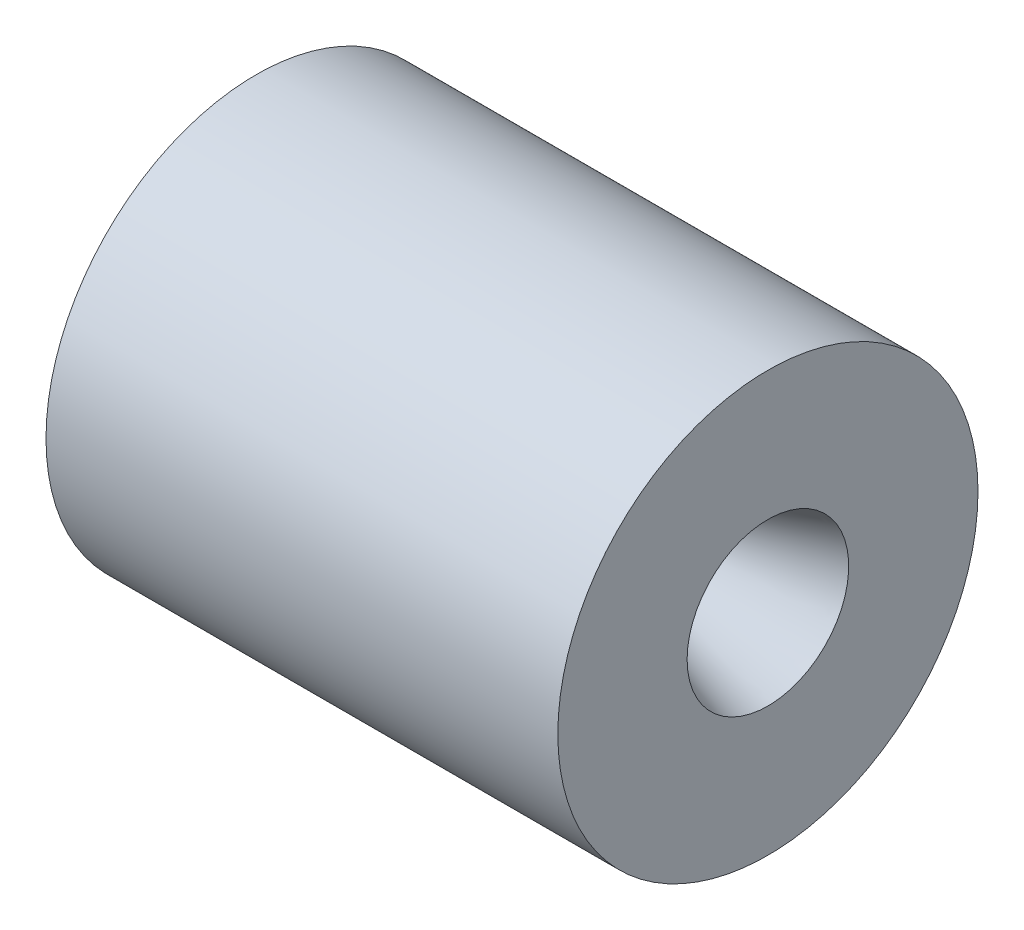
ISO-10303-21;
HEADER;
FILE_DESCRIPTION(('STEP AP214'),'2;1');
FILE_NAME('part.step','',(''),(''),'','','');
FILE_SCHEMA(('AUTOMOTIVE_DESIGN { 1 0 10303 214 1 1 1 1 }'));
ENDSEC;
DATA;
#1=APPLICATION_CONTEXT('core data for automotive mechanical design processes');
#2=APPLICATION_PROTOCOL_DEFINITION('international standard','automotive_design',2000,#1);
#3=PRODUCT_CONTEXT('',#1,'mechanical');
#4=PRODUCT('Part','Part','',(#3));
#5=PRODUCT_RELATED_PRODUCT_CATEGORY('part','',(#4));
#6=PRODUCT_DEFINITION_FORMATION('','',#4);
#7=PRODUCT_DEFINITION_CONTEXT('part definition',#1,'design');
#8=PRODUCT_DEFINITION('design','',#6,#7);
#9=PRODUCT_DEFINITION_SHAPE('','',#8);
#10=(LENGTH_UNIT() NAMED_UNIT(*) SI_UNIT(.MILLI.,.METRE.));
#11=(NAMED_UNIT(*) PLANE_ANGLE_UNIT() SI_UNIT($,.RADIAN.));
#12=(NAMED_UNIT(*) SI_UNIT($,.STERADIAN.) SOLID_ANGLE_UNIT());
#13=UNCERTAINTY_MEASURE_WITH_UNIT(LENGTH_MEASURE(1.E-05),#10,'distance_accuracy_value','');
#14=(GEOMETRIC_REPRESENTATION_CONTEXT(3) GLOBAL_UNCERTAINTY_ASSIGNED_CONTEXT((#13)) GLOBAL_UNIT_ASSIGNED_CONTEXT((#10,
#11,#12)) REPRESENTATION_CONTEXT('',''));
#15=CARTESIAN_POINT('',(0.,0.,0.));
#16=DIRECTION('',(0.,0.,1.));
#17=DIRECTION('',(1.,0.,0.));
#18=AXIS2_PLACEMENT_3D('',#15,#16,#17);
#19=CARTESIAN_POINT('',(0.,55.140272,0.));
#20=DIRECTION('',(1.,0.,0.));
#21=DIRECTION('',(0.,0.,-1.));
#22=AXIS2_PLACEMENT_3D('',#19,#20,#21);
#23=PLANE('',#22);
#24=CARTESIAN_POINT('',(0.,0.,-69.));
#25=DIRECTION('',(-1.,0.,0.));
#26=DIRECTION('',(0.,0.,1.));
#27=AXIS2_PLACEMENT_3D('',#24,#25,#26);
#28=CIRCLE('',#27,2.57975099999999);
#29=CARTESIAN_POINT('',(0.,0.,-66.420249));
#30=VERTEX_POINT('',#29);
#31=EDGE_CURVE('E118',#30,#30,#28,.T.);
#32=ORIENTED_EDGE('',*,*,#31,.F.);
#33=EDGE_LOOP('',(#32));
#34=FACE_BOUND('',#33,.T.);
#35=CARTESIAN_POINT('',(0.,-69.,-2.40912212380176E-13));
#36=DIRECTION('',(-1.,0.,0.));
#37=DIRECTION('',(0.,0.,1.));
#38=AXIS2_PLACEMENT_3D('',#35,#36,#37);
#39=CIRCLE('',#38,2.57975099999999);
#40=CARTESIAN_POINT('',(0.,-69.,2.57975099999975));
#41=VERTEX_POINT('',#40);
#42=EDGE_CURVE('E136',#41,#41,#39,.T.);
#43=ORIENTED_EDGE('',*,*,#42,.F.);
#44=EDGE_LOOP('',(#43));
#45=FACE_BOUND('',#44,.T.);
#46=CARTESIAN_POINT('',(0.,-59.7557528611264,34.4999999999999));
#47=DIRECTION('',(-1.,0.,0.));
#48=DIRECTION('',(0.,0.,1.));
#49=AXIS2_PLACEMENT_3D('',#46,#47,#48);
#50=CIRCLE('',#49,2.57975099999999);
#51=CARTESIAN_POINT('',(0.,-59.7557528611264,37.0797509999999));
#52=VERTEX_POINT('',#51);
#53=EDGE_CURVE('E142',#52,#52,#50,.T.);
#54=ORIENTED_EDGE('',*,*,#53,.F.);
#55=EDGE_LOOP('',(#54));
#56=FACE_BOUND('',#55,.T.);
#57=CARTESIAN_POINT('',(0.,-34.5000000000001,59.7557528611262));
#58=DIRECTION('',(-1.,0.,0.));
#59=DIRECTION('',(0.,0.,1.));
#60=AXIS2_PLACEMENT_3D('',#57,#58,#59);
#61=CIRCLE('',#60,2.57975099999999);
#62=CARTESIAN_POINT('',(0.,-34.5000000000001,62.3355038611262));
#63=VERTEX_POINT('',#62);
#64=EDGE_CURVE('E148',#63,#63,#61,.T.);
#65=ORIENTED_EDGE('',*,*,#64,.F.);
#66=EDGE_LOOP('',(#65));
#67=FACE_BOUND('',#66,.T.);
#68=CARTESIAN_POINT('',(0.,0.,69.));
#69=DIRECTION('',(-1.,0.,0.));
#70=DIRECTION('',(0.,0.,1.));
#71=AXIS2_PLACEMENT_3D('',#68,#69,#70);
#72=CIRCLE('',#71,2.57975099999999);
#73=CARTESIAN_POINT('',(0.,0.,71.579751));
#74=VERTEX_POINT('',#73);
#75=EDGE_CURVE('E154',#74,#74,#72,.T.);
#76=ORIENTED_EDGE('',*,*,#75,.F.);
#77=EDGE_LOOP('',(#76));
#78=FACE_BOUND('',#77,.T.);
#79=CARTESIAN_POINT('',(0.,0.,0.));
#80=DIRECTION('',(-1.,0.,0.));
#81=DIRECTION('',(0.,0.,1.));
#82=AXIS2_PLACEMENT_3D('',#79,#80,#81);
#83=CIRCLE('',#82,55.140272);
#84=CARTESIAN_POINT('',(0.,0.,55.140272));
#85=VERTEX_POINT('',#84);
#86=EDGE_CURVE('E181',#85,#85,#83,.T.);
#87=ORIENTED_EDGE('',*,*,#86,.F.);
#88=EDGE_LOOP('',(#87));
#89=FACE_BOUND('',#88,.T.);
#90=CARTESIAN_POINT('',(0.,0.,0.));
#91=DIRECTION('',(-1.,0.,0.));
#92=DIRECTION('',(0.,0.,1.));
#93=AXIS2_PLACEMENT_3D('',#90,#91,#92);
#94=CIRCLE('',#93,76.200272);
#95=CARTESIAN_POINT('',(0.,0.,76.200272));
#96=VERTEX_POINT('',#95);
#97=EDGE_CURVE('E184',#96,#96,#94,.T.);
#98=ORIENTED_EDGE('',*,*,#97,.T.);
#99=EDGE_LOOP('',(#98));
#100=FACE_BOUND('',#99,.T.);
#101=CARTESIAN_POINT('',(0.,-59.7557528611261,-34.5000000000003));
#102=DIRECTION('',(-1.,0.,0.));
#103=DIRECTION('',(0.,0.,1.));
#104=AXIS2_PLACEMENT_3D('',#101,#102,#103);
#105=CIRCLE('',#104,2.57975099999999);
#106=CARTESIAN_POINT('',(0.,-59.7557528611261,-31.9202490000003));
#107=VERTEX_POINT('',#106);
#108=EDGE_CURVE('E130',#107,#107,#105,.T.);
#109=ORIENTED_EDGE('',*,*,#108,.F.);
#110=EDGE_LOOP('',(#109));
#111=FACE_BOUND('',#110,.T.);
#112=CARTESIAN_POINT('',(0.,-34.4999999999997,-59.7557528611265));
#113=DIRECTION('',(-1.,0.,0.));
#114=DIRECTION('',(0.,0.,1.));
#115=AXIS2_PLACEMENT_3D('',#112,#113,#114);
#116=CIRCLE('',#115,2.57975099999999);
#117=CARTESIAN_POINT('',(0.,-34.4999999999997,-57.1760018611265));
#118=VERTEX_POINT('',#117);
#119=EDGE_CURVE('E124',#118,#118,#116,.T.);
#120=ORIENTED_EDGE('',*,*,#119,.F.);
#121=EDGE_LOOP('',(#120));
#122=FACE_BOUND('',#121,.T.);
#123=CARTESIAN_POINT('',(0.,34.5000000000005,-59.755752861126));
#124=DIRECTION('',(-1.,0.,0.));
#125=DIRECTION('',(0.,0.,1.));
#126=AXIS2_PLACEMENT_3D('',#123,#124,#125);
#127=CIRCLE('',#126,2.57975099999999);
#128=CARTESIAN_POINT('',(0.,34.5000000000005,-57.176001861126));
#129=VERTEX_POINT('',#128);
#130=EDGE_CURVE('E112',#129,#129,#127,.T.);
#131=ORIENTED_EDGE('',*,*,#130,.F.);
#132=EDGE_LOOP('',(#131));
#133=FACE_BOUND('',#132,.T.);
#134=CARTESIAN_POINT('',(0.,59.7557528611266,-34.4999999999994));
#135=DIRECTION('',(-1.,0.,0.));
#136=DIRECTION('',(0.,0.,1.));
#137=AXIS2_PLACEMENT_3D('',#134,#135,#136);
#138=CIRCLE('',#137,2.57975099999999);
#139=CARTESIAN_POINT('',(0.,59.7557528611266,-31.9202489999995));
#140=VERTEX_POINT('',#139);
#141=EDGE_CURVE('E106',#140,#140,#138,.T.);
#142=ORIENTED_EDGE('',*,*,#141,.F.);
#143=EDGE_LOOP('',(#142));
#144=FACE_BOUND('',#143,.T.);
#145=CARTESIAN_POINT('',(0.,69.,7.22736637140529E-13));
#146=DIRECTION('',(-1.,0.,0.));
#147=DIRECTION('',(0.,0.,1.));
#148=AXIS2_PLACEMENT_3D('',#145,#146,#147);
#149=CIRCLE('',#148,2.57975099999999);
#150=CARTESIAN_POINT('',(0.,69.,2.57975100000071));
#151=VERTEX_POINT('',#150);
#152=EDGE_CURVE('E100',#151,#151,#149,.T.);
#153=ORIENTED_EDGE('',*,*,#152,.F.);
#154=EDGE_LOOP('',(#153));
#155=FACE_BOUND('',#154,.T.);
#156=CARTESIAN_POINT('',(0.,59.7557528611259,34.5000000000007));
#157=DIRECTION('',(-1.,0.,0.));
#158=DIRECTION('',(0.,0.,1.));
#159=AXIS2_PLACEMENT_3D('',#156,#157,#158);
#160=CIRCLE('',#159,2.57975099999999);
#161=CARTESIAN_POINT('',(0.,59.7557528611259,37.0797510000007));
#162=VERTEX_POINT('',#161);
#163=EDGE_CURVE('E89',#162,#162,#160,.T.);
#164=ORIENTED_EDGE('',*,*,#163,.F.);
#165=EDGE_LOOP('',(#164));
#166=FACE_BOUND('',#165,.T.);
#167=CARTESIAN_POINT('',(0.,34.4999999999992,59.7557528611267));
#168=DIRECTION('',(-1.,0.,0.));
#169=DIRECTION('',(0.,0.,1.));
#170=AXIS2_PLACEMENT_3D('',#167,#168,#169);
#171=CIRCLE('',#170,2.57975099999999);
#172=CARTESIAN_POINT('',(0.,34.4999999999992,62.3355038611267));
#173=VERTEX_POINT('',#172);
#174=EDGE_CURVE('E90',#173,#173,#171,.T.);
#175=ORIENTED_EDGE('',*,*,#174,.F.);
#176=EDGE_LOOP('',(#175));
#177=FACE_BOUND('',#176,.T.);
#178=ADVANCED_FACE('F33',(#34,#45,#56,#67,#78,#89,#100,#111,#122,#133,#144,#155,#166,#177),#23,.F.);
#179=CARTESIAN_POINT('',(140.608875713067,14.0680911814763,0.));
#180=CARTESIAN_POINT('',(181.460140895811,28.0308978195395,0.));
#181=CARTESIAN_POINT('',(185.649173895811,29.3102708195395,0.));
#182=B_SPLINE_CURVE_WITH_KNOTS('',2,(#179,#180,#181),.UNSPECIFIED.,.F.,.F.,(3,3),(0.,1.),.UNSPECIFIED.);
#183=CARTESIAN_POINT('',(0.,0.,0.));
#184=DIRECTION('',(-1.,0.,0.));
#185=AXIS1_PLACEMENT('',#183,#184);
#186=SURFACE_OF_REVOLUTION('',#182,#185);
#187=CARTESIAN_POINT('',(185.649173895811,0.,0.));
#188=DIRECTION('',(-1.,0.,0.));
#189=DIRECTION('',(0.,0.,1.));
#190=AXIS2_PLACEMENT_3D('',#187,#188,#189);
#191=CIRCLE('',#190,29.3102708195395);
#192=CARTESIAN_POINT('',(185.649173895811,0.,29.3102708195395));
#193=VERTEX_POINT('',#192);
#194=EDGE_CURVE('E11',#193,#193,#191,.T.);
#195=ORIENTED_EDGE('',*,*,#194,.F.);
#196=EDGE_LOOP('',(#195));
#197=FACE_BOUND('',#196,.T.);
#198=CARTESIAN_POINT('',(140.608875713067,0.,0.));
#199=DIRECTION('',(-1.,0.,0.));
#200=DIRECTION('',(0.,0.,1.));
#201=AXIS2_PLACEMENT_3D('',#198,#199,#200);
#202=CIRCLE('',#201,14.0680911814763);
#203=CARTESIAN_POINT('',(140.608875713067,0.,14.0680911814763));
#204=VERTEX_POINT('',#203);
#205=EDGE_CURVE('E159',#204,#204,#202,.T.);
#206=ORIENTED_EDGE('',*,*,#205,.T.);
#207=EDGE_LOOP('',(#206));
#208=FACE_BOUND('',#207,.T.);
#209=ADVANCED_FACE('F35',(#197,#208),#186,.T.);
#210=CARTESIAN_POINT('',(185.649173895811,76.200272,0.));
#211=DIRECTION('',(-1.,0.,0.));
#212=DIRECTION('',(0.,0.,1.));
#213=AXIS2_PLACEMENT_3D('',#210,#211,#212);
#214=PLANE('',#213);
#215=CARTESIAN_POINT('',(185.649173895811,0.,0.));
#216=DIRECTION('',(-1.,0.,0.));
#217=DIRECTION('',(0.,0.,1.));
#218=AXIS2_PLACEMENT_3D('',#215,#216,#217);
#219=CIRCLE('',#218,76.200272);
#220=CARTESIAN_POINT('',(185.649173895811,0.,76.200272));
#221=VERTEX_POINT('',#220);
#222=EDGE_CURVE('E42',#221,#221,#219,.T.);
#223=ORIENTED_EDGE('',*,*,#222,.F.);
#224=EDGE_LOOP('',(#223));
#225=FACE_BOUND('',#224,.T.);
#226=ORIENTED_EDGE('',*,*,#194,.T.);
#227=EDGE_LOOP('',(#226));
#228=FACE_BOUND('',#227,.T.);
#229=ADVANCED_FACE('F191',(#225,#228),#214,.F.);
#230=CARTESIAN_POINT('',(0.,0.,0.));
#231=DIRECTION('',(-1.,0.,0.));
#232=DIRECTION('',(0.,0.,1.));
#233=AXIS2_PLACEMENT_3D('',#230,#231,#232);
#234=CYLINDRICAL_SURFACE('',#233,76.200272);
#235=ORIENTED_EDGE('',*,*,#97,.F.);
#236=EDGE_LOOP('',(#235));
#237=FACE_BOUND('',#236,.T.);
#238=ORIENTED_EDGE('',*,*,#222,.T.);
#239=EDGE_LOOP('',(#238));
#240=FACE_BOUND('',#239,.T.);
#241=ADVANCED_FACE('F189',(#237,#240),#234,.T.);
#242=CARTESIAN_POINT('',(0.,0.,0.));
#243=DIRECTION('',(-1.,0.,0.));
#244=DIRECTION('',(0.,0.,1.));
#245=AXIS2_PLACEMENT_3D('',#242,#243,#244);
#246=CYLINDRICAL_SURFACE('',#245,55.140272);
#247=CARTESIAN_POINT('',(23.150958,0.,0.));
#248=DIRECTION('',(-1.,0.,0.));
#249=DIRECTION('',(0.,0.,1.));
#250=AXIS2_PLACEMENT_3D('',#247,#248,#249);
#251=CIRCLE('',#250,55.140272);
#252=CARTESIAN_POINT('',(23.150958,0.,55.140272));
#253=VERTEX_POINT('',#252);
#254=EDGE_CURVE('E178',#253,#253,#251,.T.);
#255=ORIENTED_EDGE('',*,*,#254,.F.);
#256=EDGE_LOOP('',(#255));
#257=FACE_BOUND('',#256,.T.);
#258=ORIENTED_EDGE('',*,*,#86,.T.);
#259=EDGE_LOOP('',(#258));
#260=FACE_BOUND('',#259,.T.);
#261=ADVANCED_FACE('F222',(#257,#260),#246,.F.);
#262=CARTESIAN_POINT('',(23.1509564613662,0.,0.));
#263=DIRECTION('',(-1.,0.,0.));
#264=DIRECTION('',(0.,0.,1.));
#265=AXIS2_PLACEMENT_3D('',#262,#263,#264);
#266=DEGENERATE_TOROIDAL_SURFACE('',#265,88.860648,144.00092,.F.);
#267=CARTESIAN_POINT('',(95.151418,0.,0.));
#268=DIRECTION('',(-1.,0.,0.));
#269=DIRECTION('',(0.,0.,1.));
#270=AXIS2_PLACEMENT_3D('',#267,#268,#269);
#271=CIRCLE('',#270,35.847806);
#272=CARTESIAN_POINT('',(95.151418,0.,35.847806));
#273=VERTEX_POINT('',#272);
#274=EDGE_CURVE('E175',#273,#273,#271,.T.);
#275=ORIENTED_EDGE('',*,*,#274,.F.);
#276=EDGE_LOOP('',(#275));
#277=FACE_BOUND('',#276,.T.);
#278=ORIENTED_EDGE('',*,*,#254,.T.);
#279=EDGE_LOOP('',(#278));
#280=FACE_BOUND('',#279,.T.);
#281=ADVANCED_FACE('F216',(#277,#280),#266,.T.);
#282=CARTESIAN_POINT('',(95.151418,0.,0.));
#283=DIRECTION('',(-1.,0.,0.));
#284=DIRECTION('',(0.,0.,1.));
#285=AXIS2_PLACEMENT_3D('',#282,#283,#284);
#286=CONICAL_SURFACE('',#285,35.847806,0.523598775598299);
#287=CARTESIAN_POINT('',(128.566947895811,0.,0.));
#288=DIRECTION('',(-1.,0.,0.));
#289=DIRECTION('',(0.,0.,1.));
#290=AXIS2_PLACEMENT_3D('',#287,#288,#289);
#291=CIRCLE('',#290,16.5553408195395);
#292=CARTESIAN_POINT('',(128.566947895811,0.,16.5553408195395));
#293=VERTEX_POINT('',#292);
#294=EDGE_CURVE('E172',#293,#293,#291,.T.);
#295=ORIENTED_EDGE('',*,*,#294,.F.);
#296=EDGE_LOOP('',(#295));
#297=FACE_BOUND('',#296,.T.);
#298=ORIENTED_EDGE('',*,*,#274,.T.);
#299=EDGE_LOOP('',(#298));
#300=FACE_BOUND('',#299,.T.);
#301=ADVANCED_FACE('F210',(#297,#300),#286,.F.);
#302=CARTESIAN_POINT('',(138.905748239959,0.,0.));
#303=DIRECTION('',(-1.,0.,0.));
#304=DIRECTION('',(0.,0.,1.));
#305=AXIS2_PLACEMENT_3D('',#302,#303,#304);
#306=TOROIDAL_SURFACE('',#305,34.4626698195395,20.677602);
#307=CARTESIAN_POINT('',(138.905748895811,0.,0.));
#308=DIRECTION('',(-1.,0.,0.));
#309=DIRECTION('',(0.,0.,1.));
#310=AXIS2_PLACEMENT_3D('',#307,#308,#309);
#311=CIRCLE('',#310,13.7850678195395);
#312=CARTESIAN_POINT('',(138.905748895811,0.,13.7850678195395));
#313=VERTEX_POINT('',#312);
#314=EDGE_CURVE('E169',#313,#313,#311,.T.);
#315=ORIENTED_EDGE('',*,*,#314,.F.);
#316=EDGE_LOOP('',(#315));
#317=FACE_BOUND('',#316,.T.);
#318=ORIENTED_EDGE('',*,*,#294,.T.);
#319=EDGE_LOOP('',(#318));
#320=FACE_BOUND('',#319,.T.);
#321=ADVANCED_FACE('F204',(#317,#320),#306,.T.);
#322=CARTESIAN_POINT('',(138.905748895811,0.,0.));
#323=DIRECTION('',(-1.,0.,0.));
#324=DIRECTION('',(0.,0.,1.));
#325=AXIS2_PLACEMENT_3D('',#322,#323,#324);
#326=TOROIDAL_SURFACE('',#325,19.0509638195395,5.265896);
#327=ORIENTED_EDGE('',*,*,#205,.F.);
#328=EDGE_LOOP('',(#327));
#329=FACE_BOUND('',#328,.T.);
#330=ORIENTED_EDGE('',*,*,#314,.T.);
#331=EDGE_LOOP('',(#330));
#332=FACE_BOUND('',#331,.T.);
#333=ADVANCED_FACE('F200',(#329,#332),#326,.T.);
#334=CARTESIAN_POINT('',(12.7,0.,69.));
#335=DIRECTION('',(-1.,0.,0.));
#336=DIRECTION('',(0.,0.,1.));
#337=AXIS2_PLACEMENT_3D('',#334,#335,#336);
#338=CONICAL_SURFACE('',#337,2.57975099999999,1.02974425867665);
#339=CARTESIAN_POINT('',(14.250070782797,0.,69.));
#340=VERTEX_POINT('',#339);
#341=VERTEX_LOOP('',#340);
#342=FACE_BOUND('',#341,.T.);
#343=CARTESIAN_POINT('',(12.7,0.,69.));
#344=DIRECTION('',(-1.,0.,0.));
#345=DIRECTION('',(0.,0.,1.));
#346=AXIS2_PLACEMENT_3D('',#343,#344,#345);
#347=CIRCLE('',#346,2.57975099999999);
#348=CARTESIAN_POINT('',(12.7,0.,71.579751));
#349=VERTEX_POINT('',#348);
#350=EDGE_CURVE('E157',#349,#349,#347,.T.);
#351=ORIENTED_EDGE('',*,*,#350,.T.);
#352=EDGE_LOOP('',(#351));
#353=FACE_BOUND('',#352,.T.);
#354=ADVANCED_FACE('F203',(#342,#353),#338,.F.);
#355=CARTESIAN_POINT('',(0.,0.,69.));
#356=DIRECTION('',(-1.,0.,0.));
#357=DIRECTION('',(0.,0.,1.));
#358=AXIS2_PLACEMENT_3D('',#355,#356,#357);
#359=CYLINDRICAL_SURFACE('',#358,2.57975099999999);
#360=ORIENTED_EDGE('',*,*,#350,.F.);
#361=EDGE_LOOP('',(#360));
#362=FACE_BOUND('',#361,.T.);
#363=ORIENTED_EDGE('',*,*,#75,.T.);
#364=EDGE_LOOP('',(#363));
#365=FACE_BOUND('',#364,.T.);
#366=ADVANCED_FACE('F334',(#362,#365),#359,.F.);
#367=CARTESIAN_POINT('',(12.7,-34.5000000000001,59.7557528611262));
#368=DIRECTION('',(-1.,0.,0.));
#369=DIRECTION('',(0.,0.,1.));
#370=AXIS2_PLACEMENT_3D('',#367,#368,#369);
#371=CONICAL_SURFACE('',#370,2.57975099999999,1.02974425867665);
#372=CARTESIAN_POINT('',(14.250070782797,-34.5000000000001,59.7557528611262));
#373=VERTEX_POINT('',#372);
#374=VERTEX_LOOP('',#373);
#375=FACE_BOUND('',#374,.T.);
#376=CARTESIAN_POINT('',(12.7,-34.5000000000001,59.7557528611262));
#377=DIRECTION('',(-1.,0.,0.));
#378=DIRECTION('',(0.,0.,1.));
#379=AXIS2_PLACEMENT_3D('',#376,#377,#378);
#380=CIRCLE('',#379,2.57975099999999);
#381=CARTESIAN_POINT('',(12.7,-34.5000000000001,62.3355038611262));
#382=VERTEX_POINT('',#381);
#383=EDGE_CURVE('E151',#382,#382,#380,.T.);
#384=ORIENTED_EDGE('',*,*,#383,.T.);
#385=EDGE_LOOP('',(#384));
#386=FACE_BOUND('',#385,.T.);
#387=ADVANCED_FACE('F330',(#375,#386),#371,.F.);
#388=CARTESIAN_POINT('',(0.,-34.5000000000001,59.7557528611262));
#389=DIRECTION('',(-1.,0.,0.));
#390=DIRECTION('',(0.,0.,1.));
#391=AXIS2_PLACEMENT_3D('',#388,#389,#390);
#392=CYLINDRICAL_SURFACE('',#391,2.57975099999999);
#393=ORIENTED_EDGE('',*,*,#383,.F.);
#394=EDGE_LOOP('',(#393));
#395=FACE_BOUND('',#394,.T.);
#396=ORIENTED_EDGE('',*,*,#64,.T.);
#397=EDGE_LOOP('',(#396));
#398=FACE_BOUND('',#397,.T.);
#399=ADVANCED_FACE('F326',(#395,#398),#392,.F.);
#400=CARTESIAN_POINT('',(12.7,-59.7557528611264,34.4999999999999));
#401=DIRECTION('',(-1.,0.,0.));
#402=DIRECTION('',(0.,0.,1.));
#403=AXIS2_PLACEMENT_3D('',#400,#401,#402);
#404=CONICAL_SURFACE('',#403,2.57975099999998,1.02974425867665);
#405=CARTESIAN_POINT('',(14.250070782797,-59.7557528611264,34.4999999999999));
#406=VERTEX_POINT('',#405);
#407=VERTEX_LOOP('',#406);
#408=FACE_BOUND('',#407,.T.);
#409=CARTESIAN_POINT('',(12.7,-59.7557528611264,34.4999999999999));
#410=DIRECTION('',(-1.,0.,0.));
#411=DIRECTION('',(0.,0.,1.));
#412=AXIS2_PLACEMENT_3D('',#409,#410,#411);
#413=CIRCLE('',#412,2.57975099999998);
#414=CARTESIAN_POINT('',(12.7,-59.7557528611264,37.0797509999998));
#415=VERTEX_POINT('',#414);
#416=EDGE_CURVE('E145',#415,#415,#413,.T.);
#417=ORIENTED_EDGE('',*,*,#416,.T.);
#418=EDGE_LOOP('',(#417));
#419=FACE_BOUND('',#418,.T.);
#420=ADVANCED_FACE('F322',(#408,#419),#404,.F.);
#421=CARTESIAN_POINT('',(0.,-59.7557528611264,34.4999999999999));
#422=DIRECTION('',(-1.,0.,0.));
#423=DIRECTION('',(0.,0.,1.));
#424=AXIS2_PLACEMENT_3D('',#421,#422,#423);
#425=CYLINDRICAL_SURFACE('',#424,2.57975099999999);
#426=ORIENTED_EDGE('',*,*,#416,.F.);
#427=EDGE_LOOP('',(#426));
#428=FACE_BOUND('',#427,.T.);
#429=ORIENTED_EDGE('',*,*,#53,.T.);
#430=EDGE_LOOP('',(#429));
#431=FACE_BOUND('',#430,.T.);
#432=ADVANCED_FACE('F318',(#428,#431),#425,.F.);
#433=CARTESIAN_POINT('',(12.7,-69.,-2.40912212380176E-13));
#434=DIRECTION('',(-1.,0.,0.));
#435=DIRECTION('',(0.,0.,1.));
#436=AXIS2_PLACEMENT_3D('',#433,#434,#435);
#437=CONICAL_SURFACE('',#436,2.57975099999999,1.02974425867665);
#438=CARTESIAN_POINT('',(14.250070782797,-69.,-2.40912212380176E-13));
#439=VERTEX_POINT('',#438);
#440=VERTEX_LOOP('',#439);
#441=FACE_BOUND('',#440,.T.);
#442=CARTESIAN_POINT('',(12.7,-69.,-2.40912212380176E-13));
#443=DIRECTION('',(-1.,0.,0.));
#444=DIRECTION('',(0.,0.,1.));
#445=AXIS2_PLACEMENT_3D('',#442,#443,#444);
#446=CIRCLE('',#445,2.57975099999999);
#447=CARTESIAN_POINT('',(12.7,-69.,2.57975099999975));
#448=VERTEX_POINT('',#447);
#449=EDGE_CURVE('E139',#448,#448,#446,.T.);
#450=ORIENTED_EDGE('',*,*,#449,.T.);
#451=EDGE_LOOP('',(#450));
#452=FACE_BOUND('',#451,.T.);
#453=ADVANCED_FACE('F314',(#441,#452),#437,.F.);
#454=CARTESIAN_POINT('',(0.,-69.,-2.40912212380176E-13));
#455=DIRECTION('',(-1.,0.,0.));
#456=DIRECTION('',(0.,0.,1.));
#457=AXIS2_PLACEMENT_3D('',#454,#455,#456);
#458=CYLINDRICAL_SURFACE('',#457,2.57975099999999);
#459=ORIENTED_EDGE('',*,*,#449,.F.);
#460=EDGE_LOOP('',(#459));
#461=FACE_BOUND('',#460,.T.);
#462=ORIENTED_EDGE('',*,*,#42,.T.);
#463=EDGE_LOOP('',(#462));
#464=FACE_BOUND('',#463,.T.);
#465=ADVANCED_FACE('F310',(#461,#464),#458,.F.);
#466=CARTESIAN_POINT('',(12.7,-59.7557528611261,-34.5000000000003));
#467=DIRECTION('',(-1.,0.,0.));
#468=DIRECTION('',(0.,0.,1.));
#469=AXIS2_PLACEMENT_3D('',#466,#467,#468);
#470=CONICAL_SURFACE('',#469,2.57975099999999,1.02974425867665);
#471=CARTESIAN_POINT('',(14.250070782797,-59.7557528611261,-34.5000000000003));
#472=VERTEX_POINT('',#471);
#473=VERTEX_LOOP('',#472);
#474=FACE_BOUND('',#473,.T.);
#475=CARTESIAN_POINT('',(12.7,-59.7557528611261,-34.5000000000003));
#476=DIRECTION('',(-1.,0.,0.));
#477=DIRECTION('',(0.,0.,1.));
#478=AXIS2_PLACEMENT_3D('',#475,#476,#477);
#479=CIRCLE('',#478,2.57975099999999);
#480=CARTESIAN_POINT('',(12.7,-59.7557528611261,-31.9202490000003));
#481=VERTEX_POINT('',#480);
#482=EDGE_CURVE('E133',#481,#481,#479,.T.);
#483=ORIENTED_EDGE('',*,*,#482,.T.);
#484=EDGE_LOOP('',(#483));
#485=FACE_BOUND('',#484,.T.);
#486=ADVANCED_FACE('F306',(#474,#485),#470,.F.);
#487=CARTESIAN_POINT('',(0.,-59.7557528611261,-34.5000000000003));
#488=DIRECTION('',(-1.,0.,0.));
#489=DIRECTION('',(0.,0.,1.));
#490=AXIS2_PLACEMENT_3D('',#487,#488,#489);
#491=CYLINDRICAL_SURFACE('',#490,2.57975099999999);
#492=ORIENTED_EDGE('',*,*,#482,.F.);
#493=EDGE_LOOP('',(#492));
#494=FACE_BOUND('',#493,.T.);
#495=ORIENTED_EDGE('',*,*,#108,.T.);
#496=EDGE_LOOP('',(#495));
#497=FACE_BOUND('',#496,.T.);
#498=ADVANCED_FACE('F302',(#494,#497),#491,.F.);
#499=CARTESIAN_POINT('',(12.7,-34.4999999999997,-59.7557528611265));
#500=DIRECTION('',(-1.,0.,0.));
#501=DIRECTION('',(0.,0.,1.));
#502=AXIS2_PLACEMENT_3D('',#499,#500,#501);
#503=CONICAL_SURFACE('',#502,2.57975099999999,1.02974425867665);
#504=CARTESIAN_POINT('',(14.250070782797,-34.4999999999997,-59.7557528611265));
#505=VERTEX_POINT('',#504);
#506=VERTEX_LOOP('',#505);
#507=FACE_BOUND('',#506,.T.);
#508=CARTESIAN_POINT('',(12.7,-34.4999999999997,-59.7557528611265));
#509=DIRECTION('',(-1.,0.,0.));
#510=DIRECTION('',(0.,0.,1.));
#511=AXIS2_PLACEMENT_3D('',#508,#509,#510);
#512=CIRCLE('',#511,2.57975099999999);
#513=CARTESIAN_POINT('',(12.7,-34.4999999999997,-57.1760018611265));
#514=VERTEX_POINT('',#513);
#515=EDGE_CURVE('E127',#514,#514,#512,.T.);
#516=ORIENTED_EDGE('',*,*,#515,.T.);
#517=EDGE_LOOP('',(#516));
#518=FACE_BOUND('',#517,.T.);
#519=ADVANCED_FACE('F298',(#507,#518),#503,.F.);
#520=CARTESIAN_POINT('',(0.,-34.4999999999997,-59.7557528611265));
#521=DIRECTION('',(-1.,0.,0.));
#522=DIRECTION('',(0.,0.,1.));
#523=AXIS2_PLACEMENT_3D('',#520,#521,#522);
#524=CYLINDRICAL_SURFACE('',#523,2.57975099999999);
#525=ORIENTED_EDGE('',*,*,#515,.F.);
#526=EDGE_LOOP('',(#525));
#527=FACE_BOUND('',#526,.T.);
#528=ORIENTED_EDGE('',*,*,#119,.T.);
#529=EDGE_LOOP('',(#528));
#530=FACE_BOUND('',#529,.T.);
#531=ADVANCED_FACE('F294',(#527,#530),#524,.F.);
#532=CARTESIAN_POINT('',(12.7,0.,-69.));
#533=DIRECTION('',(-1.,0.,0.));
#534=DIRECTION('',(0.,0.,1.));
#535=AXIS2_PLACEMENT_3D('',#532,#533,#534);
#536=CONICAL_SURFACE('',#535,2.57975099999999,1.02974425867665);
#537=CARTESIAN_POINT('',(14.250070782797,0.,-69.));
#538=VERTEX_POINT('',#537);
#539=VERTEX_LOOP('',#538);
#540=FACE_BOUND('',#539,.T.);
#541=CARTESIAN_POINT('',(12.7,0.,-69.));
#542=DIRECTION('',(-1.,0.,0.));
#543=DIRECTION('',(0.,0.,1.));
#544=AXIS2_PLACEMENT_3D('',#541,#542,#543);
#545=CIRCLE('',#544,2.57975099999999);
#546=CARTESIAN_POINT('',(12.7,0.,-66.420249));
#547=VERTEX_POINT('',#546);
#548=EDGE_CURVE('E121',#547,#547,#545,.T.);
#549=ORIENTED_EDGE('',*,*,#548,.T.);
#550=EDGE_LOOP('',(#549));
#551=FACE_BOUND('',#550,.T.);
#552=ADVANCED_FACE('F290',(#540,#551),#536,.F.);
#553=CARTESIAN_POINT('',(0.,0.,-69.));
#554=DIRECTION('',(-1.,0.,0.));
#555=DIRECTION('',(0.,0.,1.));
#556=AXIS2_PLACEMENT_3D('',#553,#554,#555);
#557=CYLINDRICAL_SURFACE('',#556,2.57975099999999);
#558=ORIENTED_EDGE('',*,*,#548,.F.);
#559=EDGE_LOOP('',(#558));
#560=FACE_BOUND('',#559,.T.);
#561=ORIENTED_EDGE('',*,*,#31,.T.);
#562=EDGE_LOOP('',(#561));
#563=FACE_BOUND('',#562,.T.);
#564=ADVANCED_FACE('F286',(#560,#563),#557,.F.);
#565=CARTESIAN_POINT('',(12.7,34.5000000000005,-59.755752861126));
#566=DIRECTION('',(-1.,0.,0.));
#567=DIRECTION('',(0.,0.,1.));
#568=AXIS2_PLACEMENT_3D('',#565,#566,#567);
#569=CONICAL_SURFACE('',#568,2.57975099999998,1.02974425867665);
#570=CARTESIAN_POINT('',(14.250070782797,34.5000000000005,-59.755752861126));
#571=VERTEX_POINT('',#570);
#572=VERTEX_LOOP('',#571);
#573=FACE_BOUND('',#572,.T.);
#574=CARTESIAN_POINT('',(12.7,34.5000000000005,-59.755752861126));
#575=DIRECTION('',(-1.,0.,0.));
#576=DIRECTION('',(0.,0.,1.));
#577=AXIS2_PLACEMENT_3D('',#574,#575,#576);
#578=CIRCLE('',#577,2.57975099999998);
#579=CARTESIAN_POINT('',(12.7,34.5000000000005,-57.176001861126));
#580=VERTEX_POINT('',#579);
#581=EDGE_CURVE('E115',#580,#580,#578,.T.);
#582=ORIENTED_EDGE('',*,*,#581,.T.);
#583=EDGE_LOOP('',(#582));
#584=FACE_BOUND('',#583,.T.);
#585=ADVANCED_FACE('F282',(#573,#584),#569,.F.);
#586=CARTESIAN_POINT('',(0.,34.5000000000005,-59.755752861126));
#587=DIRECTION('',(-1.,0.,0.));
#588=DIRECTION('',(0.,0.,1.));
#589=AXIS2_PLACEMENT_3D('',#586,#587,#588);
#590=CYLINDRICAL_SURFACE('',#589,2.57975099999999);
#591=ORIENTED_EDGE('',*,*,#581,.F.);
#592=EDGE_LOOP('',(#591));
#593=FACE_BOUND('',#592,.T.);
#594=ORIENTED_EDGE('',*,*,#130,.T.);
#595=EDGE_LOOP('',(#594));
#596=FACE_BOUND('',#595,.T.);
#597=ADVANCED_FACE('F278',(#593,#596),#590,.F.);
#598=CARTESIAN_POINT('',(12.7,59.7557528611266,-34.4999999999994));
#599=DIRECTION('',(-1.,0.,0.));
#600=DIRECTION('',(0.,0.,1.));
#601=AXIS2_PLACEMENT_3D('',#598,#599,#600);
#602=CONICAL_SURFACE('',#601,2.57975099999998,1.02974425867665);
#603=CARTESIAN_POINT('',(14.250070782797,59.7557528611266,-34.4999999999994));
#604=VERTEX_POINT('',#603);
#605=VERTEX_LOOP('',#604);
#606=FACE_BOUND('',#605,.T.);
#607=CARTESIAN_POINT('',(12.7,59.7557528611266,-34.4999999999994));
#608=DIRECTION('',(-1.,0.,0.));
#609=DIRECTION('',(0.,0.,1.));
#610=AXIS2_PLACEMENT_3D('',#607,#608,#609);
#611=CIRCLE('',#610,2.57975099999998);
#612=CARTESIAN_POINT('',(12.7,59.7557528611266,-31.9202489999995));
#613=VERTEX_POINT('',#612);
#614=EDGE_CURVE('E109',#613,#613,#611,.T.);
#615=ORIENTED_EDGE('',*,*,#614,.T.);
#616=EDGE_LOOP('',(#615));
#617=FACE_BOUND('',#616,.T.);
#618=ADVANCED_FACE('F274',(#606,#617),#602,.F.);
#619=CARTESIAN_POINT('',(0.,59.7557528611266,-34.4999999999994));
#620=DIRECTION('',(-1.,0.,0.));
#621=DIRECTION('',(0.,0.,1.));
#622=AXIS2_PLACEMENT_3D('',#619,#620,#621);
#623=CYLINDRICAL_SURFACE('',#622,2.57975099999999);
#624=ORIENTED_EDGE('',*,*,#614,.F.);
#625=EDGE_LOOP('',(#624));
#626=FACE_BOUND('',#625,.T.);
#627=ORIENTED_EDGE('',*,*,#141,.T.);
#628=EDGE_LOOP('',(#627));
#629=FACE_BOUND('',#628,.T.);
#630=ADVANCED_FACE('F270',(#626,#629),#623,.F.);
#631=CARTESIAN_POINT('',(12.7,69.,7.22736637140529E-13));
#632=DIRECTION('',(-1.,0.,0.));
#633=DIRECTION('',(0.,0.,1.));
#634=AXIS2_PLACEMENT_3D('',#631,#632,#633);
#635=CONICAL_SURFACE('',#634,2.57975099999999,1.02974425867665);
#636=CARTESIAN_POINT('',(14.250070782797,69.,7.22736637140529E-13));
#637=VERTEX_POINT('',#636);
#638=VERTEX_LOOP('',#637);
#639=FACE_BOUND('',#638,.T.);
#640=CARTESIAN_POINT('',(12.7,69.,7.22736637140529E-13));
#641=DIRECTION('',(-1.,0.,0.));
#642=DIRECTION('',(0.,0.,1.));
#643=AXIS2_PLACEMENT_3D('',#640,#641,#642);
#644=CIRCLE('',#643,2.57975099999999);
#645=CARTESIAN_POINT('',(12.7,69.,2.57975100000071));
#646=VERTEX_POINT('',#645);
#647=EDGE_CURVE('E103',#646,#646,#644,.T.);
#648=ORIENTED_EDGE('',*,*,#647,.T.);
#649=EDGE_LOOP('',(#648));
#650=FACE_BOUND('',#649,.T.);
#651=ADVANCED_FACE('F266',(#639,#650),#635,.F.);
#652=CARTESIAN_POINT('',(0.,69.,7.22736637140529E-13));
#653=DIRECTION('',(-1.,0.,0.));
#654=DIRECTION('',(0.,0.,1.));
#655=AXIS2_PLACEMENT_3D('',#652,#653,#654);
#656=CYLINDRICAL_SURFACE('',#655,2.57975099999999);
#657=ORIENTED_EDGE('',*,*,#647,.F.);
#658=EDGE_LOOP('',(#657));
#659=FACE_BOUND('',#658,.T.);
#660=ORIENTED_EDGE('',*,*,#152,.T.);
#661=EDGE_LOOP('',(#660));
#662=FACE_BOUND('',#661,.T.);
#663=ADVANCED_FACE('F262',(#659,#662),#656,.F.);
#664=CARTESIAN_POINT('',(12.7,59.7557528611259,34.5000000000007));
#665=DIRECTION('',(-1.,0.,0.));
#666=DIRECTION('',(0.,0.,1.));
#667=AXIS2_PLACEMENT_3D('',#664,#665,#666);
#668=CONICAL_SURFACE('',#667,2.57975099999998,1.02974425867665);
#669=CARTESIAN_POINT('',(14.250070782797,59.7557528611259,34.5000000000007));
#670=VERTEX_POINT('',#669);
#671=VERTEX_LOOP('',#670);
#672=FACE_BOUND('',#671,.T.);
#673=CARTESIAN_POINT('',(12.7,59.7557528611259,34.5000000000007));
#674=DIRECTION('',(-1.,0.,0.));
#675=DIRECTION('',(0.,0.,1.));
#676=AXIS2_PLACEMENT_3D('',#673,#674,#675);
#677=CIRCLE('',#676,2.57975099999998);
#678=CARTESIAN_POINT('',(12.7,59.7557528611259,37.0797510000007));
#679=VERTEX_POINT('',#678);
#680=EDGE_CURVE('E93',#679,#679,#677,.T.);
#681=ORIENTED_EDGE('',*,*,#680,.T.);
#682=EDGE_LOOP('',(#681));
#683=FACE_BOUND('',#682,.T.);
#684=ADVANCED_FACE('F258',(#672,#683),#668,.F.);
#685=CARTESIAN_POINT('',(0.,59.7557528611259,34.5000000000007));
#686=DIRECTION('',(-1.,0.,0.));
#687=DIRECTION('',(0.,0.,1.));
#688=AXIS2_PLACEMENT_3D('',#685,#686,#687);
#689=CYLINDRICAL_SURFACE('',#688,2.57975099999999);
#690=ORIENTED_EDGE('',*,*,#680,.F.);
#691=EDGE_LOOP('',(#690));
#692=FACE_BOUND('',#691,.T.);
#693=ORIENTED_EDGE('',*,*,#163,.T.);
#694=EDGE_LOOP('',(#693));
#695=FACE_BOUND('',#694,.T.);
#696=ADVANCED_FACE('F83',(#692,#695),#689,.F.);
#697=CARTESIAN_POINT('',(12.7,34.4999999999992,59.7557528611267));
#698=DIRECTION('',(-1.,0.,0.));
#699=DIRECTION('',(0.,0.,1.));
#700=AXIS2_PLACEMENT_3D('',#697,#698,#699);
#701=CONICAL_SURFACE('',#700,2.57975099999999,1.02974425867665);
#702=CARTESIAN_POINT('',(14.250070782797,34.4999999999992,59.7557528611267));
#703=VERTEX_POINT('',#702);
#704=VERTEX_LOOP('',#703);
#705=FACE_BOUND('',#704,.T.);
#706=CARTESIAN_POINT('',(12.7,34.4999999999992,59.7557528611267));
#707=DIRECTION('',(-1.,0.,0.));
#708=DIRECTION('',(0.,0.,1.));
#709=AXIS2_PLACEMENT_3D('',#706,#707,#708);
#710=CIRCLE('',#709,2.57975099999999);
#711=CARTESIAN_POINT('',(12.7,34.4999999999992,62.3355038611267));
#712=VERTEX_POINT('',#711);
#713=EDGE_CURVE('E87',#712,#712,#710,.T.);
#714=ORIENTED_EDGE('',*,*,#713,.T.);
#715=EDGE_LOOP('',(#714));
#716=FACE_BOUND('',#715,.T.);
#717=ADVANCED_FACE('F79',(#705,#716),#701,.F.);
#718=CARTESIAN_POINT('',(0.,34.4999999999992,59.7557528611267));
#719=DIRECTION('',(-1.,0.,0.));
#720=DIRECTION('',(0.,0.,1.));
#721=AXIS2_PLACEMENT_3D('',#718,#719,#720);
#722=CYLINDRICAL_SURFACE('',#721,2.57975099999999);
#723=ORIENTED_EDGE('',*,*,#713,.F.);
#724=EDGE_LOOP('',(#723));
#725=FACE_BOUND('',#724,.T.);
#726=ORIENTED_EDGE('',*,*,#174,.T.);
#727=EDGE_LOOP('',(#726));
#728=FACE_BOUND('',#727,.T.);
#729=ADVANCED_FACE('F82',(#725,#728),#722,.F.);
#730=CLOSED_SHELL('',(#178,#209,#229,#241,#261,#281,#301,#321,#333,#354,#366,#387,#399,#420,
#432,#453,#465,#486,#498,#519,#531,#552,#564,#585,#597,#618,#630,#651,#663,#684,#696,#717,#729));
#731=MANIFOLD_SOLID_BREP('B2',#730);
#732=ADVANCED_BREP_SHAPE_REPRESENTATION('',(#18,#731),#14);
#733=SHAPE_DEFINITION_REPRESENTATION(#9,#732);
ENDSEC;
END-ISO-10303-21;
